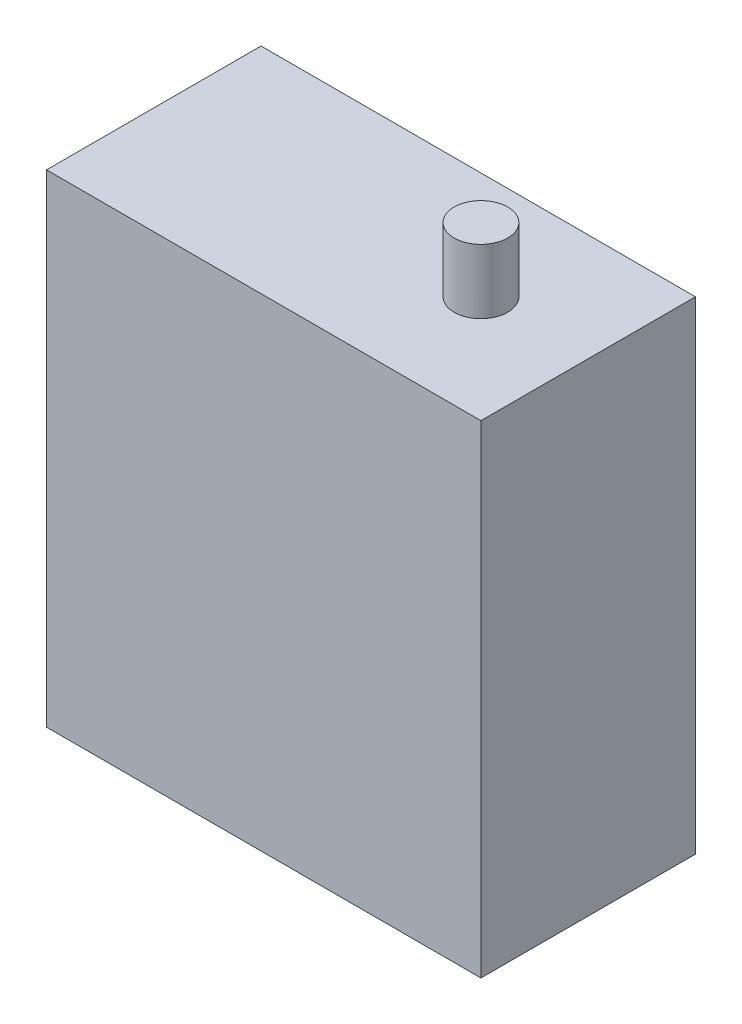
ISO-10303-21;
HEADER;
FILE_DESCRIPTION(('STEP AP214'),'2;1');
FILE_NAME('part.step','',(''),(''),'','','');
FILE_SCHEMA(('AUTOMOTIVE_DESIGN { 1 0 10303 214 1 1 1 1 }'));
ENDSEC;
DATA;
#1=APPLICATION_CONTEXT('core data for automotive mechanical design processes');
#2=APPLICATION_PROTOCOL_DEFINITION('international standard','automotive_design',2000,#1);
#3=PRODUCT_CONTEXT('',#1,'mechanical');
#4=PRODUCT('Part','Part','',(#3));
#5=PRODUCT_RELATED_PRODUCT_CATEGORY('part','',(#4));
#6=PRODUCT_DEFINITION_FORMATION('','',#4);
#7=PRODUCT_DEFINITION_CONTEXT('part definition',#1,'design');
#8=PRODUCT_DEFINITION('design','',#6,#7);
#9=PRODUCT_DEFINITION_SHAPE('','',#8);
#10=(LENGTH_UNIT() NAMED_UNIT(*) SI_UNIT(.MILLI.,.METRE.));
#11=(NAMED_UNIT(*) PLANE_ANGLE_UNIT() SI_UNIT($,.RADIAN.));
#12=(NAMED_UNIT(*) SI_UNIT($,.STERADIAN.) SOLID_ANGLE_UNIT());
#13=UNCERTAINTY_MEASURE_WITH_UNIT(LENGTH_MEASURE(1.E-05),#10,'distance_accuracy_value','');
#14=(GEOMETRIC_REPRESENTATION_CONTEXT(3) GLOBAL_UNCERTAINTY_ASSIGNED_CONTEXT((#13)) GLOBAL_UNIT_ASSIGNED_CONTEXT((#10,
#11,#12)) REPRESENTATION_CONTEXT('',''));
#15=CARTESIAN_POINT('',(0.,0.,0.));
#16=DIRECTION('',(0.,0.,1.));
#17=DIRECTION('',(1.,0.,0.));
#18=AXIS2_PLACEMENT_3D('',#15,#16,#17);
#19=CARTESIAN_POINT('',(20.25,22.5,20.));
#20=DIRECTION('',(-1.,0.,0.));
#21=DIRECTION('',(0.,-1.,0.));
#22=AXIS2_PLACEMENT_3D('',#19,#20,#21);
#23=PLANE('',#22);
#24=DIRECTION('',(0.,1.,0.));
#25=VECTOR('',#24,1.);
#26=CARTESIAN_POINT('',(20.25,22.5,0.));
#27=LINE('',#26,#25);
#28=CARTESIAN_POINT('',(20.25,-22.5,0.));
#29=VERTEX_POINT('',#28);
#30=CARTESIAN_POINT('',(20.25,22.5,0.));
#31=VERTEX_POINT('',#30);
#32=EDGE_CURVE('E116',#29,#31,#27,.T.);
#33=ORIENTED_EDGE('',*,*,#32,.T.);
#34=DIRECTION('',(0.,0.,-1.));
#35=VECTOR('',#34,1.);
#36=CARTESIAN_POINT('',(20.25,22.5,20.));
#37=LINE('',#36,#35);
#38=CARTESIAN_POINT('',(20.25,22.5,20.));
#39=VERTEX_POINT('',#38);
#40=EDGE_CURVE('E54',#39,#31,#37,.T.);
#41=ORIENTED_EDGE('',*,*,#40,.F.);
#42=DIRECTION('',(0.,1.,0.));
#43=VECTOR('',#42,1.);
#44=CARTESIAN_POINT('',(20.25,22.5,20.));
#45=LINE('',#44,#43);
#46=CARTESIAN_POINT('',(20.25,-22.5,20.));
#47=VERTEX_POINT('',#46);
#48=EDGE_CURVE('E98',#47,#39,#45,.T.);
#49=ORIENTED_EDGE('',*,*,#48,.F.);
#50=DIRECTION('',(0.,0.,-1.));
#51=VECTOR('',#50,1.);
#52=CARTESIAN_POINT('',(20.25,-22.5,20.));
#53=LINE('',#52,#51);
#54=EDGE_CURVE('E112',#47,#29,#53,.T.);
#55=ORIENTED_EDGE('',*,*,#54,.T.);
#56=EDGE_LOOP('',(#33,#41,#49,#55));
#57=FACE_BOUND('',#56,.T.);
#58=ADVANCED_FACE('F45',(#57),#23,.F.);
#59=CARTESIAN_POINT('',(-20.25,22.5,20.));
#60=DIRECTION('',(0.,-1.,0.));
#61=DIRECTION('',(0.,0.,-1.));
#62=AXIS2_PLACEMENT_3D('',#59,#60,#61);
#63=PLANE('',#62);
#64=CARTESIAN_POINT('',(10.25,22.5,10.));
#65=DIRECTION('',(0.,-1.,0.));
#66=DIRECTION('',(0.,0.,-1.));
#67=AXIS2_PLACEMENT_3D('',#64,#65,#66);
#68=CIRCLE('',#67,2.5);
#69=CARTESIAN_POINT('',(10.25,22.5,7.5));
#70=VERTEX_POINT('',#69);
#71=EDGE_CURVE('E11',#70,#70,#68,.F.);
#72=ORIENTED_EDGE('',*,*,#71,.F.);
#73=EDGE_LOOP('',(#72));
#74=FACE_BOUND('',#73,.T.);
#75=DIRECTION('',(-1.,0.,0.));
#76=VECTOR('',#75,1.);
#77=CARTESIAN_POINT('',(-20.25,22.5,0.));
#78=LINE('',#77,#76);
#79=CARTESIAN_POINT('',(-20.25,22.5,0.));
#80=VERTEX_POINT('',#79);
#81=EDGE_CURVE('E104',#31,#80,#78,.T.);
#82=ORIENTED_EDGE('',*,*,#81,.T.);
#83=DIRECTION('',(0.,0.,-1.));
#84=VECTOR('',#83,1.);
#85=CARTESIAN_POINT('',(-20.25,22.5,20.));
#86=LINE('',#85,#84);
#87=CARTESIAN_POINT('',(-20.25,22.5,20.));
#88=VERTEX_POINT('',#87);
#89=EDGE_CURVE('E102',#88,#80,#86,.T.);
#90=ORIENTED_EDGE('',*,*,#89,.F.);
#91=DIRECTION('',(-1.,0.,0.));
#92=VECTOR('',#91,1.);
#93=CARTESIAN_POINT('',(-20.25,22.5,20.));
#94=LINE('',#93,#92);
#95=EDGE_CURVE('E93',#39,#88,#94,.T.);
#96=ORIENTED_EDGE('',*,*,#95,.F.);
#97=ORIENTED_EDGE('',*,*,#40,.T.);
#98=EDGE_LOOP('',(#82,#90,#96,#97));
#99=FACE_BOUND('',#98,.T.);
#100=ADVANCED_FACE('F103',(#74,#99),#63,.F.);
#101=CARTESIAN_POINT('',(-20.25,22.5,20.));
#102=DIRECTION('',(1.,0.,0.));
#103=DIRECTION('',(0.,0.,-1.));
#104=AXIS2_PLACEMENT_3D('',#101,#102,#103);
#105=PLANE('',#104);
#106=DIRECTION('',(0.,-1.,0.));
#107=VECTOR('',#106,1.);
#108=CARTESIAN_POINT('',(-20.25,22.5,0.));
#109=LINE('',#108,#107);
#110=CARTESIAN_POINT('',(-20.25,-22.5,0.));
#111=VERTEX_POINT('',#110);
#112=EDGE_CURVE('E79',#80,#111,#109,.T.);
#113=ORIENTED_EDGE('',*,*,#112,.T.);
#114=DIRECTION('',(0.,0.,-1.));
#115=VECTOR('',#114,1.);
#116=CARTESIAN_POINT('',(-20.25,-22.5,20.));
#117=LINE('',#116,#115);
#118=CARTESIAN_POINT('',(-20.25,-22.5,20.));
#119=VERTEX_POINT('',#118);
#120=EDGE_CURVE('E106',#119,#111,#117,.T.);
#121=ORIENTED_EDGE('',*,*,#120,.F.);
#122=DIRECTION('',(0.,-1.,0.));
#123=VECTOR('',#122,1.);
#124=CARTESIAN_POINT('',(-20.25,22.5,20.));
#125=LINE('',#124,#123);
#126=EDGE_CURVE('E96',#88,#119,#125,.T.);
#127=ORIENTED_EDGE('',*,*,#126,.F.);
#128=ORIENTED_EDGE('',*,*,#89,.T.);
#129=EDGE_LOOP('',(#113,#121,#127,#128));
#130=FACE_BOUND('',#129,.T.);
#131=ADVANCED_FACE('F108',(#130),#105,.F.);
#132=CARTESIAN_POINT('',(-20.25,-22.5,20.));
#133=DIRECTION('',(0.,1.,0.));
#134=DIRECTION('',(0.,0.,1.));
#135=AXIS2_PLACEMENT_3D('',#132,#133,#134);
#136=PLANE('',#135);
#137=CARTESIAN_POINT('',(0.,-22.5,10.));
#138=DIRECTION('',(0.,-1.,0.));
#139=DIRECTION('',(0.,0.,-1.));
#140=AXIS2_PLACEMENT_3D('',#137,#138,#139);
#141=CIRCLE('',#140,2.54845028746618);
#142=CARTESIAN_POINT('',(0.,-22.5,7.45154971253382));
#143=VERTEX_POINT('',#142);
#144=EDGE_CURVE('E166',#143,#143,#141,.T.);
#145=ORIENTED_EDGE('',*,*,#144,.F.);
#146=EDGE_LOOP('',(#145));
#147=FACE_BOUND('',#146,.T.);
#148=DIRECTION('',(1.,0.,0.));
#149=VECTOR('',#148,1.);
#150=CARTESIAN_POINT('',(-20.25,-22.5,0.));
#151=LINE('',#150,#149);
#152=EDGE_CURVE('E85',#111,#29,#151,.T.);
#153=ORIENTED_EDGE('',*,*,#152,.T.);
#154=ORIENTED_EDGE('',*,*,#54,.F.);
#155=DIRECTION('',(1.,0.,0.));
#156=VECTOR('',#155,1.);
#157=CARTESIAN_POINT('',(-20.25,-22.5,20.));
#158=LINE('',#157,#156);
#159=EDGE_CURVE('E62',#119,#47,#158,.T.);
#160=ORIENTED_EDGE('',*,*,#159,.F.);
#161=ORIENTED_EDGE('',*,*,#120,.T.);
#162=EDGE_LOOP('',(#153,#154,#160,#161));
#163=FACE_BOUND('',#162,.T.);
#164=ADVANCED_FACE('F146',(#147,#163),#136,.F.);
#165=CARTESIAN_POINT('',(0.,0.,20.));
#166=DIRECTION('',(0.,0.,1.));
#167=DIRECTION('',(1.,0.,0.));
#168=AXIS2_PLACEMENT_3D('',#165,#166,#167);
#169=PLANE('',#168);
#170=ORIENTED_EDGE('',*,*,#48,.T.);
#171=ORIENTED_EDGE('',*,*,#95,.T.);
#172=ORIENTED_EDGE('',*,*,#126,.T.);
#173=ORIENTED_EDGE('',*,*,#159,.T.);
#174=EDGE_LOOP('',(#170,#171,#172,#173));
#175=FACE_BOUND('',#174,.T.);
#176=ADVANCED_FACE('F94',(#175),#169,.T.);
#177=CARTESIAN_POINT('',(0.,0.,0.));
#178=DIRECTION('',(0.,0.,1.));
#179=DIRECTION('',(1.,0.,0.));
#180=AXIS2_PLACEMENT_3D('',#177,#178,#179);
#181=PLANE('',#180);
#182=ORIENTED_EDGE('',*,*,#32,.F.);
#183=ORIENTED_EDGE('',*,*,#152,.F.);
#184=ORIENTED_EDGE('',*,*,#112,.F.);
#185=ORIENTED_EDGE('',*,*,#81,.F.);
#186=EDGE_LOOP('',(#182,#183,#184,#185));
#187=FACE_BOUND('',#186,.T.);
#188=ADVANCED_FACE('F134',(#187),#181,.F.);
#189=CARTESIAN_POINT('',(10.25,28.5,10.));
#190=DIRECTION('',(0.,-1.,0.));
#191=DIRECTION('',(0.,0.,-1.));
#192=AXIS2_PLACEMENT_3D('',#189,#190,#191);
#193=CYLINDRICAL_SURFACE('',#192,2.5);
#194=CARTESIAN_POINT('',(10.25,28.5,10.));
#195=DIRECTION('',(0.,1.,0.));
#196=DIRECTION('',(0.,0.,1.));
#197=AXIS2_PLACEMENT_3D('',#194,#195,#196);
#198=CIRCLE('',#197,2.5);
#199=CARTESIAN_POINT('',(10.25,28.5,12.5));
#200=VERTEX_POINT('',#199);
#201=EDGE_CURVE('E120',#200,#200,#198,.T.);
#202=ORIENTED_EDGE('',*,*,#201,.F.);
#203=EDGE_LOOP('',(#202));
#204=FACE_BOUND('',#203,.T.);
#205=ORIENTED_EDGE('',*,*,#71,.T.);
#206=EDGE_LOOP('',(#205));
#207=FACE_BOUND('',#206,.T.);
#208=ADVANCED_FACE('F136',(#204,#207),#193,.T.);
#209=CARTESIAN_POINT('',(10.25,28.5,10.));
#210=DIRECTION('',(0.,1.,0.));
#211=DIRECTION('',(0.,0.,1.));
#212=AXIS2_PLACEMENT_3D('',#209,#210,#211);
#213=PLANE('',#212);
#214=ORIENTED_EDGE('',*,*,#201,.T.);
#215=EDGE_LOOP('',(#214));
#216=FACE_BOUND('',#215,.T.);
#217=ADVANCED_FACE('F143',(#216),#213,.T.);
#218=CARTESIAN_POINT('',(0.,-12.5,10.));
#219=DIRECTION('',(0.,-1.,0.));
#220=DIRECTION('',(0.,0.,-1.));
#221=AXIS2_PLACEMENT_3D('',#218,#219,#220);
#222=CYLINDRICAL_SURFACE('',#221,2.54845028746618);
#223=CARTESIAN_POINT('',(0.,-12.5,10.));
#224=DIRECTION('',(0.,-1.,0.));
#225=DIRECTION('',(0.,0.,-1.));
#226=AXIS2_PLACEMENT_3D('',#223,#224,#225);
#227=CIRCLE('',#226,2.54845028746618);
#228=CARTESIAN_POINT('',(0.,-12.5,7.45154971253382));
#229=VERTEX_POINT('',#228);
#230=EDGE_CURVE('E169',#229,#229,#227,.T.);
#231=ORIENTED_EDGE('',*,*,#230,.F.);
#232=EDGE_LOOP('',(#231));
#233=FACE_BOUND('',#232,.T.);
#234=ORIENTED_EDGE('',*,*,#144,.T.);
#235=EDGE_LOOP('',(#234));
#236=FACE_BOUND('',#235,.T.);
#237=ADVANCED_FACE('F181',(#233,#236),#222,.F.);
#238=CARTESIAN_POINT('',(0.,-12.5,10.));
#239=DIRECTION('',(0.,-1.,0.));
#240=DIRECTION('',(0.,0.,-1.));
#241=AXIS2_PLACEMENT_3D('',#238,#239,#240);
#242=PLANE('',#241);
#243=ORIENTED_EDGE('',*,*,#230,.T.);
#244=EDGE_LOOP('',(#243));
#245=FACE_BOUND('',#244,.T.);
#246=ADVANCED_FACE('F185',(#245),#242,.T.);
#247=CLOSED_SHELL('',(#58,#100,#131,#164,#176,#188,#208,#217,#237,#246));
#248=MANIFOLD_SOLID_BREP('B2',#247);
#249=ADVANCED_BREP_SHAPE_REPRESENTATION('',(#18,#248),#14);
#250=SHAPE_DEFINITION_REPRESENTATION(#9,#249);
ENDSEC;
END-ISO-10303-21;
